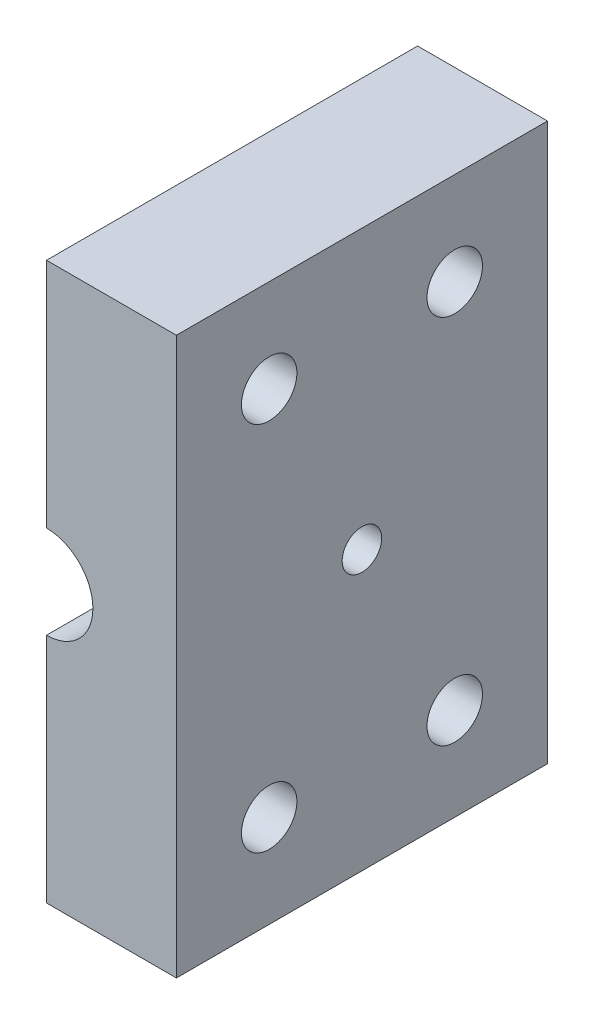
ISO-10303-21;
HEADER;
FILE_DESCRIPTION(('STEP AP214'),'2;1');
FILE_NAME('part.step','',(''),(''),'','','');
FILE_SCHEMA(('AUTOMOTIVE_DESIGN { 1 0 10303 214 1 1 1 1 }'));
ENDSEC;
DATA;
#1=APPLICATION_CONTEXT('core data for automotive mechanical design processes');
#2=APPLICATION_PROTOCOL_DEFINITION('international standard','automotive_design',2000,#1);
#3=PRODUCT_CONTEXT('',#1,'mechanical');
#4=PRODUCT('Part','Part','',(#3));
#5=PRODUCT_RELATED_PRODUCT_CATEGORY('part','',(#4));
#6=PRODUCT_DEFINITION_FORMATION('','',#4);
#7=PRODUCT_DEFINITION_CONTEXT('part definition',#1,'design');
#8=PRODUCT_DEFINITION('design','',#6,#7);
#9=PRODUCT_DEFINITION_SHAPE('','',#8);
#10=(LENGTH_UNIT() NAMED_UNIT(*) SI_UNIT(.MILLI.,.METRE.));
#11=(NAMED_UNIT(*) PLANE_ANGLE_UNIT() SI_UNIT($,.RADIAN.));
#12=(NAMED_UNIT(*) SI_UNIT($,.STERADIAN.) SOLID_ANGLE_UNIT());
#13=UNCERTAINTY_MEASURE_WITH_UNIT(LENGTH_MEASURE(1.E-05),#10,'distance_accuracy_value','');
#14=(GEOMETRIC_REPRESENTATION_CONTEXT(3) GLOBAL_UNCERTAINTY_ASSIGNED_CONTEXT((#13)) GLOBAL_UNIT_ASSIGNED_CONTEXT((#10,
#11,#12)) REPRESENTATION_CONTEXT('',''));
#15=CARTESIAN_POINT('',(0.,0.,0.));
#16=DIRECTION('',(0.,0.,1.));
#17=DIRECTION('',(1.,0.,0.));
#18=AXIS2_PLACEMENT_3D('',#15,#16,#17);
#19=CARTESIAN_POINT('',(4.445,-12.7,12.7));
#20=DIRECTION('',(-1.,0.,0.));
#21=DIRECTION('',(0.,0.,1.));
#22=AXIS2_PLACEMENT_3D('',#19,#20,#21);
#23=PLANE('',#22);
#24=CARTESIAN_POINT('',(4.445,-6.34988648419594,0.));
#25=DIRECTION('',(1.,0.,0.));
#26=DIRECTION('',(0.,0.,-1.));
#27=AXIS2_PLACEMENT_3D('',#24,#25,#26);
#28=CIRCLE('',#27,1.35255);
#29=CARTESIAN_POINT('',(4.445,-6.34988648419594,-1.35255));
#30=VERTEX_POINT('',#29);
#31=EDGE_CURVE('E183',#30,#30,#28,.T.);
#32=ORIENTED_EDGE('',*,*,#31,.F.);
#33=EDGE_LOOP('',(#32));
#34=FACE_BOUND('',#33,.T.);
#35=CARTESIAN_POINT('',(4.445,-19.0498864841959,6.35));
#36=DIRECTION('',(1.,0.,0.));
#37=DIRECTION('',(0.,0.,-1.));
#38=AXIS2_PLACEMENT_3D('',#35,#36,#37);
#39=CIRCLE('',#38,1.89864999999999);
#40=CARTESIAN_POINT('',(4.445,-19.0498864841959,4.45135000000001));
#41=VERTEX_POINT('',#40);
#42=EDGE_CURVE('E179',#41,#41,#39,.T.);
#43=ORIENTED_EDGE('',*,*,#42,.F.);
#44=EDGE_LOOP('',(#43));
#45=FACE_BOUND('',#44,.T.);
#46=CARTESIAN_POINT('',(4.445,6.35,6.35));
#47=DIRECTION('',(1.,0.,0.));
#48=DIRECTION('',(0.,0.,-1.));
#49=AXIS2_PLACEMENT_3D('',#46,#47,#48);
#50=CIRCLE('',#49,1.89864999999999);
#51=CARTESIAN_POINT('',(4.445,6.35,4.45135000000001));
#52=VERTEX_POINT('',#51);
#53=EDGE_CURVE('E138',#52,#52,#50,.T.);
#54=ORIENTED_EDGE('',*,*,#53,.F.);
#55=EDGE_LOOP('',(#54));
#56=FACE_BOUND('',#55,.T.);
#57=CARTESIAN_POINT('',(4.445,6.35,-6.35));
#58=DIRECTION('',(1.,0.,0.));
#59=DIRECTION('',(0.,0.,-1.));
#60=AXIS2_PLACEMENT_3D('',#57,#58,#59);
#61=CIRCLE('',#60,1.89864999999999);
#62=CARTESIAN_POINT('',(4.445,6.35,-8.24864999999999));
#63=VERTEX_POINT('',#62);
#64=EDGE_CURVE('E127',#63,#63,#61,.T.);
#65=ORIENTED_EDGE('',*,*,#64,.F.);
#66=EDGE_LOOP('',(#65));
#67=FACE_BOUND('',#66,.T.);
#68=DIRECTION('',(0.,0.,-1.));
#69=VECTOR('',#68,1.);
#70=CARTESIAN_POINT('',(4.445,12.7,12.7));
#71=LINE('',#70,#69);
#72=CARTESIAN_POINT('',(4.445,12.7,12.7));
#73=VERTEX_POINT('',#72);
#74=CARTESIAN_POINT('',(4.445,12.7,-12.7));
#75=VERTEX_POINT('',#74);
#76=EDGE_CURVE('E53',#73,#75,#71,.T.);
#77=ORIENTED_EDGE('',*,*,#76,.F.);
#78=DIRECTION('',(0.,1.,0.));
#79=VECTOR('',#78,1.);
#80=CARTESIAN_POINT('',(4.445,-12.7,12.7));
#81=LINE('',#80,#79);
#82=CARTESIAN_POINT('',(4.445,-25.3998864841959,12.7));
#83=VERTEX_POINT('',#82);
#84=EDGE_CURVE('E104',#83,#73,#81,.T.);
#85=ORIENTED_EDGE('',*,*,#84,.F.);
#86=DIRECTION('',(0.,0.,-1.));
#87=VECTOR('',#86,1.);
#88=CARTESIAN_POINT('',(4.445,-25.3998864841959,12.7));
#89=LINE('',#88,#87);
#90=CARTESIAN_POINT('',(4.445,-25.3998864841959,-12.7));
#91=VERTEX_POINT('',#90);
#92=EDGE_CURVE('E146',#83,#91,#89,.T.);
#93=ORIENTED_EDGE('',*,*,#92,.T.);
#94=DIRECTION('',(0.,1.,0.));
#95=VECTOR('',#94,1.);
#96=CARTESIAN_POINT('',(4.445,-12.7,-12.7));
#97=LINE('',#96,#95);
#98=EDGE_CURVE('E92',#91,#75,#97,.T.);
#99=ORIENTED_EDGE('',*,*,#98,.T.);
#100=EDGE_LOOP('',(#77,#85,#93,#99));
#101=FACE_BOUND('',#100,.T.);
#102=CARTESIAN_POINT('',(4.445,-19.0498864841959,-6.35));
#103=DIRECTION('',(1.,0.,0.));
#104=DIRECTION('',(0.,0.,-1.));
#105=AXIS2_PLACEMENT_3D('',#102,#103,#104);
#106=CIRCLE('',#105,1.89864999999999);
#107=CARTESIAN_POINT('',(4.445,-19.0498864841959,-8.24864999999999));
#108=VERTEX_POINT('',#107);
#109=EDGE_CURVE('E171',#108,#108,#106,.T.);
#110=ORIENTED_EDGE('',*,*,#109,.F.);
#111=EDGE_LOOP('',(#110));
#112=FACE_BOUND('',#111,.T.);
#113=ADVANCED_FACE('F39',(#34,#45,#56,#67,#101,#112),#23,.F.);
#114=CARTESIAN_POINT('',(-4.445,-12.7,12.7));
#115=DIRECTION('',(1.,0.,0.));
#116=DIRECTION('',(0.,0.,-1.));
#117=AXIS2_PLACEMENT_3D('',#114,#115,#116);
#118=PLANE('',#117);
#119=CARTESIAN_POINT('',(-4.445,6.35,-6.35));
#120=DIRECTION('',(1.,0.,0.));
#121=DIRECTION('',(0.,0.,-1.));
#122=AXIS2_PLACEMENT_3D('',#119,#120,#121);
#123=CIRCLE('',#122,1.89865);
#124=CARTESIAN_POINT('',(-4.445,6.35,-8.24865));
#125=VERTEX_POINT('',#124);
#126=EDGE_CURVE('E122',#125,#125,#123,.T.);
#127=ORIENTED_EDGE('',*,*,#126,.T.);
#128=EDGE_LOOP('',(#127));
#129=FACE_BOUND('',#128,.T.);
#130=CARTESIAN_POINT('',(-4.445,6.35,6.35));
#131=DIRECTION('',(1.,0.,0.));
#132=DIRECTION('',(0.,0.,-1.));
#133=AXIS2_PLACEMENT_3D('',#130,#131,#132);
#134=CIRCLE('',#133,1.89865);
#135=CARTESIAN_POINT('',(-4.445,6.35,4.45135));
#136=VERTEX_POINT('',#135);
#137=EDGE_CURVE('E132',#136,#136,#134,.T.);
#138=ORIENTED_EDGE('',*,*,#137,.T.);
#139=EDGE_LOOP('',(#138));
#140=FACE_BOUND('',#139,.T.);
#141=DIRECTION('',(0.,0.,1.));
#142=VECTOR('',#141,1.);
#143=CARTESIAN_POINT('',(-4.445,-3.17488648419594,-12.7));
#144=LINE('',#143,#142);
#145=CARTESIAN_POINT('',(-4.445,-3.17488648419594,12.7));
#146=VERTEX_POINT('',#145);
#147=CARTESIAN_POINT('',(-4.445,-3.17488648419594,-12.7));
#148=VERTEX_POINT('',#147);
#149=EDGE_CURVE('E60',#146,#148,#144,.F.);
#150=ORIENTED_EDGE('',*,*,#149,.F.);
#151=DIRECTION('',(0.,-1.,0.));
#152=VECTOR('',#151,1.);
#153=CARTESIAN_POINT('',(-4.445,-12.7,12.7));
#154=LINE('',#153,#152);
#155=CARTESIAN_POINT('',(-4.445,12.7,12.7));
#156=VERTEX_POINT('',#155);
#157=EDGE_CURVE('E98',#156,#146,#154,.T.);
#158=ORIENTED_EDGE('',*,*,#157,.F.);
#159=DIRECTION('',(0.,0.,-1.));
#160=VECTOR('',#159,1.);
#161=CARTESIAN_POINT('',(-4.445,12.7,12.7));
#162=LINE('',#161,#160);
#163=CARTESIAN_POINT('',(-4.445,12.7,-12.7));
#164=VERTEX_POINT('',#163);
#165=EDGE_CURVE('E84',#156,#164,#162,.T.);
#166=ORIENTED_EDGE('',*,*,#165,.T.);
#167=DIRECTION('',(0.,-1.,0.));
#168=VECTOR('',#167,1.);
#169=CARTESIAN_POINT('',(-4.445,-12.7,-12.7));
#170=LINE('',#169,#168);
#171=EDGE_CURVE('E97',#164,#148,#170,.T.);
#172=ORIENTED_EDGE('',*,*,#171,.T.);
#173=EDGE_LOOP('',(#150,#158,#166,#172));
#174=FACE_BOUND('',#173,.T.);
#175=ADVANCED_FACE('F96',(#129,#140,#174),#118,.F.);
#176=CARTESIAN_POINT('',(-4.445,-19.0498864841959,6.35));
#177=DIRECTION('',(1.,0.,0.));
#178=DIRECTION('',(0.,0.,-1.));
#179=AXIS2_PLACEMENT_3D('',#176,#177,#178);
#180=CIRCLE('',#179,1.89865);
#181=CARTESIAN_POINT('',(-4.445,-19.0498864841959,4.45135));
#182=VERTEX_POINT('',#181);
#183=EDGE_CURVE('E175',#182,#182,#180,.T.);
#184=ORIENTED_EDGE('',*,*,#183,.T.);
#185=EDGE_LOOP('',(#184));
#186=FACE_BOUND('',#185,.T.);
#187=CARTESIAN_POINT('',(-4.445,-19.0498864841959,-6.35));
#188=DIRECTION('',(1.,0.,0.));
#189=DIRECTION('',(0.,0.,-1.));
#190=AXIS2_PLACEMENT_3D('',#187,#188,#189);
#191=CIRCLE('',#190,1.89865);
#192=CARTESIAN_POINT('',(-4.445,-19.0498864841959,-8.24865));
#193=VERTEX_POINT('',#192);
#194=EDGE_CURVE('E167',#193,#193,#191,.T.);
#195=ORIENTED_EDGE('',*,*,#194,.T.);
#196=EDGE_LOOP('',(#195));
#197=FACE_BOUND('',#196,.T.);
#198=DIRECTION('',(0.,0.,1.));
#199=VECTOR('',#198,1.);
#200=CARTESIAN_POINT('',(-4.445,-9.52488648419594,-12.7));
#201=LINE('',#200,#199);
#202=CARTESIAN_POINT('',(-4.445,-9.52488648419594,-12.7));
#203=VERTEX_POINT('',#202);
#204=CARTESIAN_POINT('',(-4.445,-9.52488648419594,12.7));
#205=VERTEX_POINT('',#204);
#206=EDGE_CURVE('E159',#203,#205,#201,.T.);
#207=ORIENTED_EDGE('',*,*,#206,.F.);
#208=CARTESIAN_POINT('',(-4.445,-25.3998864841959,-12.7));
#209=VERTEX_POINT('',#208);
#210=EDGE_CURVE('E91',#203,#209,#170,.T.);
#211=ORIENTED_EDGE('',*,*,#210,.T.);
#212=DIRECTION('',(0.,0.,-1.));
#213=VECTOR('',#212,1.);
#214=CARTESIAN_POINT('',(-4.445,-25.3998864841959,12.7));
#215=LINE('',#214,#213);
#216=CARTESIAN_POINT('',(-4.445,-25.3998864841959,12.7));
#217=VERTEX_POINT('',#216);
#218=EDGE_CURVE('E142',#217,#209,#215,.T.);
#219=ORIENTED_EDGE('',*,*,#218,.F.);
#220=EDGE_CURVE('E115',#205,#217,#154,.T.);
#221=ORIENTED_EDGE('',*,*,#220,.F.);
#222=EDGE_LOOP('',(#207,#211,#219,#221));
#223=FACE_BOUND('',#222,.T.);
#224=ADVANCED_FACE('F214',(#186,#197,#223),#118,.F.);
#225=CARTESIAN_POINT('',(-4.445,12.7,12.7));
#226=DIRECTION('',(0.,-1.,0.));
#227=DIRECTION('',(0.,0.,-1.));
#228=AXIS2_PLACEMENT_3D('',#225,#226,#227);
#229=PLANE('',#228);
#230=DIRECTION('',(-1.,0.,0.));
#231=VECTOR('',#230,1.);
#232=CARTESIAN_POINT('',(-4.445,12.7,-12.7));
#233=LINE('',#232,#231);
#234=EDGE_CURVE('E81',#75,#164,#233,.T.);
#235=ORIENTED_EDGE('',*,*,#234,.T.);
#236=ORIENTED_EDGE('',*,*,#165,.F.);
#237=DIRECTION('',(-1.,0.,0.));
#238=VECTOR('',#237,1.);
#239=CARTESIAN_POINT('',(-4.445,12.7,12.7));
#240=LINE('',#239,#238);
#241=EDGE_CURVE('E68',#73,#156,#240,.T.);
#242=ORIENTED_EDGE('',*,*,#241,.F.);
#243=ORIENTED_EDGE('',*,*,#76,.T.);
#244=EDGE_LOOP('',(#235,#236,#242,#243));
#245=FACE_BOUND('',#244,.T.);
#246=ADVANCED_FACE('F83',(#245),#229,.F.);
#247=CARTESIAN_POINT('',(0.,0.,12.7));
#248=DIRECTION('',(0.,0.,-1.));
#249=DIRECTION('',(-1.,0.,0.));
#250=AXIS2_PLACEMENT_3D('',#247,#248,#249);
#251=PLANE('',#250);
#252=CARTESIAN_POINT('',(-4.445,-6.34988648419594,12.7));
#253=DIRECTION('',(0.,0.,-1.));
#254=DIRECTION('',(1.,0.,0.));
#255=AXIS2_PLACEMENT_3D('',#252,#253,#254);
#256=CIRCLE('',#255,3.175);
#257=EDGE_CURVE('E163',#146,#205,#256,.T.);
#258=ORIENTED_EDGE('',*,*,#257,.T.);
#259=ORIENTED_EDGE('',*,*,#220,.T.);
#260=DIRECTION('',(-1.,0.,0.));
#261=VECTOR('',#260,1.);
#262=CARTESIAN_POINT('',(-4.445,-25.3998864841959,12.7));
#263=LINE('',#262,#261);
#264=EDGE_CURVE('E149',#83,#217,#263,.T.);
#265=ORIENTED_EDGE('',*,*,#264,.F.);
#266=ORIENTED_EDGE('',*,*,#84,.T.);
#267=ORIENTED_EDGE('',*,*,#241,.T.);
#268=ORIENTED_EDGE('',*,*,#157,.T.);
#269=EDGE_LOOP('',(#258,#259,#265,#266,#267,#268));
#270=FACE_BOUND('',#269,.T.);
#271=ADVANCED_FACE('F232',(#270),#251,.F.);
#272=CARTESIAN_POINT('',(0.,0.,-12.7));
#273=DIRECTION('',(0.,0.,-1.));
#274=DIRECTION('',(-1.,0.,0.));
#275=AXIS2_PLACEMENT_3D('',#272,#273,#274);
#276=PLANE('',#275);
#277=ORIENTED_EDGE('',*,*,#210,.F.);
#278=CARTESIAN_POINT('',(-4.445,-6.34988648419594,-12.7));
#279=DIRECTION('',(0.,0.,-1.));
#280=DIRECTION('',(-1.,0.,0.));
#281=AXIS2_PLACEMENT_3D('',#278,#279,#280);
#282=CIRCLE('',#281,3.175);
#283=EDGE_CURVE('E11',#203,#148,#282,.F.);
#284=ORIENTED_EDGE('',*,*,#283,.T.);
#285=ORIENTED_EDGE('',*,*,#171,.F.);
#286=ORIENTED_EDGE('',*,*,#234,.F.);
#287=ORIENTED_EDGE('',*,*,#98,.F.);
#288=DIRECTION('',(-1.,0.,0.));
#289=VECTOR('',#288,1.);
#290=CARTESIAN_POINT('',(-4.445,-25.3998864841959,-12.7));
#291=LINE('',#290,#289);
#292=EDGE_CURVE('E150',#91,#209,#291,.T.);
#293=ORIENTED_EDGE('',*,*,#292,.T.);
#294=EDGE_LOOP('',(#277,#284,#285,#286,#287,#293));
#295=FACE_BOUND('',#294,.T.);
#296=ADVANCED_FACE('F102',(#295),#276,.T.);
#297=CARTESIAN_POINT('',(4.445,6.35,-6.35));
#298=DIRECTION('',(1.,0.,0.));
#299=DIRECTION('',(0.,0.,-1.));
#300=AXIS2_PLACEMENT_3D('',#297,#298,#299);
#301=CYLINDRICAL_SURFACE('',#300,1.89864999999999);
#302=ORIENTED_EDGE('',*,*,#126,.F.);
#303=EDGE_LOOP('',(#302));
#304=FACE_BOUND('',#303,.T.);
#305=ORIENTED_EDGE('',*,*,#64,.T.);
#306=EDGE_LOOP('',(#305));
#307=FACE_BOUND('',#306,.T.);
#308=ADVANCED_FACE('F255',(#304,#307),#301,.F.);
#309=CARTESIAN_POINT('',(4.445,6.35,6.35));
#310=DIRECTION('',(1.,0.,0.));
#311=DIRECTION('',(0.,0.,-1.));
#312=AXIS2_PLACEMENT_3D('',#309,#310,#311);
#313=CYLINDRICAL_SURFACE('',#312,1.89864999999999);
#314=ORIENTED_EDGE('',*,*,#137,.F.);
#315=EDGE_LOOP('',(#314));
#316=FACE_BOUND('',#315,.T.);
#317=ORIENTED_EDGE('',*,*,#53,.T.);
#318=EDGE_LOOP('',(#317));
#319=FACE_BOUND('',#318,.T.);
#320=ADVANCED_FACE('F205',(#316,#319),#313,.F.);
#321=CARTESIAN_POINT('',(-4.445,-25.3998864841959,12.7));
#322=DIRECTION('',(0.,-1.,0.));
#323=DIRECTION('',(0.,0.,-1.));
#324=AXIS2_PLACEMENT_3D('',#321,#322,#323);
#325=PLANE('',#324);
#326=ORIENTED_EDGE('',*,*,#292,.F.);
#327=ORIENTED_EDGE('',*,*,#92,.F.);
#328=ORIENTED_EDGE('',*,*,#264,.T.);
#329=ORIENTED_EDGE('',*,*,#218,.T.);
#330=EDGE_LOOP('',(#326,#327,#328,#329));
#331=FACE_BOUND('',#330,.T.);
#332=ADVANCED_FACE('F197',(#331),#325,.T.);
#333=CARTESIAN_POINT('',(-4.445,-6.34988648419594,-12.7));
#334=DIRECTION('',(0.,0.,1.));
#335=DIRECTION('',(1.,0.,0.));
#336=AXIS2_PLACEMENT_3D('',#333,#334,#335);
#337=CYLINDRICAL_SURFACE('',#336,3.175);
#338=CARTESIAN_POINT('',(-1.27,-6.34988648419594,-1.35255));
#339=CARTESIAN_POINT('',(-1.27000623572589,-6.42219846451424,-1.35254177520316));
#340=CARTESIAN_POINT('',(-1.27249877734005,-6.49461684016538,-1.34671677085276));
#341=CARTESIAN_POINT('',(-1.28222933200378,-6.63739473726526,-1.32362700946327));
#342=CARTESIAN_POINT('',(-1.28947941494836,-6.7077485453532,-1.30633315473188));
#343=CARTESIAN_POINT('',(-1.30794757605062,-6.84409542411831,-1.26106652134826));
#344=CARTESIAN_POINT('',(-1.31915195717244,-6.91010262588238,-1.23313057893921));
#345=CARTESIAN_POINT('',(-1.3444448189785,-7.03642729183296,-1.16752831329107));
#346=CARTESIAN_POINT('',(-1.3585324980903,-7.09674633056627,-1.12986469363826));
#347=CARTESIAN_POINT('',(-1.38900915331412,-7.21321710574948,-1.0438105223501));
#348=CARTESIAN_POINT('',(-1.40547568228455,-7.26903452718969,-0.994995222634553));
#349=CARTESIAN_POINT('',(-1.43852728544038,-7.37198028393577,-0.888922536238248));
#350=CARTESIAN_POINT('',(-1.45511241953689,-7.41910385014982,-0.831660546858984));
#351=CARTESIAN_POINT('',(-1.48749082528527,-7.50574837069998,-0.706716145718509));
#352=CARTESIAN_POINT('',(-1.50319814752368,-7.54474693296262,-0.638646839132888));
#353=CARTESIAN_POINT('',(-1.53080506901161,-7.6105914820798,-0.49615021576441));
#354=CARTESIAN_POINT('',(-1.54270671610151,-7.63744400797353,-0.421726345794151));
#355=CARTESIAN_POINT('',(-1.56051145918116,-7.6768378559283,-0.272481782098255));
#356=CARTESIAN_POINT('',(-1.56668329881164,-7.69002415000419,-0.197864666492723));
#357=CARTESIAN_POINT('',(-1.57309836071018,-7.70372154087681,-0.0472414110769816));
#358=CARTESIAN_POINT('',(-1.57334506936866,-7.70424009146956,0.0287638855657466));
#359=CARTESIAN_POINT('',(-1.568108377168,-7.69307144302101,0.173443537838061));
#360=CARTESIAN_POINT('',(-1.56308648663574,-7.68236735611834,0.242213910729962));
#361=CARTESIAN_POINT('',(-1.54866138788291,-7.65071197240058,0.376868979127113));
#362=CARTESIAN_POINT('',(-1.53925729498791,-7.62975860642926,0.442753089017099));
#363=CARTESIAN_POINT('',(-1.51691251050134,-7.57778735787967,0.571467277566886));
#364=CARTESIAN_POINT('',(-1.50389945655985,-7.5465608060842,0.634199971759613));
#365=CARTESIAN_POINT('',(-1.47581800626709,-7.47507786228482,0.753786225805841));
#366=CARTESIAN_POINT('',(-1.46074878044514,-7.43481782187801,0.810637396664927));
#367=CARTESIAN_POINT('',(-1.42862746406358,-7.34222043412414,0.922155886563748));
#368=CARTESIAN_POINT('',(-1.41151806794821,-7.28912847923528,0.976181952101856));
#369=CARTESIAN_POINT('',(-1.37836740362582,-7.17447632336111,1.07478447159879));
#370=CARTESIAN_POINT('',(-1.36232640930725,-7.11291396326408,1.11935850884433));
#371=CARTESIAN_POINT('',(-1.33261513120812,-6.98104448280009,1.19879081738166));
#372=CARTESIAN_POINT('',(-1.31901451729778,-6.9105565487564,1.23337691862214));
#373=CARTESIAN_POINT('',(-1.29625611843984,-6.76403508112224,1.28997295749315));
#374=CARTESIAN_POINT('',(-1.28709576441307,-6.68800478364138,1.31199016864093));
#375=CARTESIAN_POINT('',(-1.27473667441957,-6.53790593653124,1.34145508065906));
#376=CARTESIAN_POINT('',(-1.27118674037708,-6.46403510206559,1.3497626553015));
#377=CARTESIAN_POINT('',(-1.26931894633364,-6.31587505598112,1.35415007319995));
#378=CARTESIAN_POINT('',(-1.27099949649573,-6.24158597834166,1.35023363201766));
#379=CARTESIAN_POINT('',(-1.27917756400135,-6.09880011825048,1.33088956002413));
#380=CARTESIAN_POINT('',(-1.28541814242532,-6.03020376577893,1.31607566728751));
#381=CARTESIAN_POINT('',(-1.30180917961208,-5.89655136894943,1.27622243273565));
#382=CARTESIAN_POINT('',(-1.31196012658546,-5.83149576781319,1.25118181408736));
#383=CARTESIAN_POINT('',(-1.33559882938075,-5.70447569207693,1.19077167332886));
#384=CARTESIAN_POINT('',(-1.3491808260904,-5.64267102482548,1.15510422025462));
#385=CARTESIAN_POINT('',(-1.37824560386068,-5.52570160440114,1.07477896391606));
#386=CARTESIAN_POINT('',(-1.39372919175528,-5.4705396895055,1.03011733930006));
#387=CARTESIAN_POINT('',(-1.42636323436333,-5.36409570547136,0.929182397251462));
#388=CARTESIAN_POINT('',(-1.44355191136597,-5.31340925341944,0.872291725552819));
#389=CARTESIAN_POINT('',(-1.47664307461845,-5.22212525734779,0.750556976311339));
#390=CARTESIAN_POINT('',(-1.49254521721794,-5.18153040296456,0.685710785307665));
#391=CARTESIAN_POINT('',(-1.52141696954082,-5.11102835560137,0.548342425907144));
#392=CARTESIAN_POINT('',(-1.53433173374422,-5.0813159630934,0.475707882643422));
#393=CARTESIAN_POINT('',(-1.55504298242463,-5.03480720416642,0.325740640673739));
#394=CARTESIAN_POINT('',(-1.56284394545572,-5.01799953386144,0.248412117884265));
#395=CARTESIAN_POINT('',(-1.57173933574315,-4.99892432330592,0.0978910164841012));
#396=CARTESIAN_POINT('',(-1.57331866815372,-4.99560481430568,0.0248599209182086));
#397=CARTESIAN_POINT('',(-1.57089019483181,-5.00076581451601,-0.120681637221436));
#398=CARTESIAN_POINT('',(-1.56688334515951,-5.00924430453002,-0.193192186750541));
#399=CARTESIAN_POINT('',(-1.55418564427915,-5.03686393195468,-0.331824440239766));
#400=CARTESIAN_POINT('',(-1.54574332748994,-5.05544096806303,-0.398083526320236));
#401=CARTESIAN_POINT('',(-1.52533189330868,-5.10216473337459,-0.526552401255484));
#402=CARTESIAN_POINT('',(-1.51336177586075,-5.1303141764986,-0.588761035780507));
#403=CARTESIAN_POINT('',(-1.48633025829184,-5.19737611748046,-0.711549455942926));
#404=CARTESIAN_POINT('',(-1.47112387846321,-5.23684470559234,-0.77179297640017));
#405=CARTESIAN_POINT('',(-1.43971820410057,-5.32466480920209,-0.885130502729461));
#406=CARTESIAN_POINT('',(-1.4235185422797,-5.37301962392983,-0.938221840448122));
#407=CARTESIAN_POINT('',(-1.39044277788364,-5.48168662414724,-1.03999082551859));
#408=CARTESIAN_POINT('',(-1.37361167934036,-5.5426353880506,-1.08800664347723));
#409=CARTESIAN_POINT('',(-1.34242083517483,-5.67233945124827,-1.17317457940271));
#410=CARTESIAN_POINT('',(-1.32806221166188,-5.74109827169172,-1.21032177006529));
#411=CARTESIAN_POINT('',(-1.30361687982752,-5.88353723947577,-1.27194468564941));
#412=CARTESIAN_POINT('',(-1.29346920592053,-5.9571278823606,-1.29660247811649));
#413=CARTESIAN_POINT('',(-1.27834415730268,-6.1078082003418,-1.33295039769719));
#414=CARTESIAN_POINT('',(-1.27335073019146,-6.18488622671191,-1.34468079369904));
#415=CARTESIAN_POINT('',(-1.27040063678853,-6.29148515631913,-1.35160755828298));
#416=CARTESIAN_POINT('',(-1.2699974811717,-6.3206771403385,-1.35255332228377));
#417=CARTESIAN_POINT('',(-1.27,-6.34988648419594,-1.35255));
#418=B_SPLINE_CURVE_WITH_KNOTS('',3,(#338,#339,#340,#341,#342,#343,#344,#345,#346,#347,#348,
#349,#350,#351,#352,#353,#354,#355,#356,#357,#358,#359,#360,#361,#362,#363,#364,#365,#366,#367,
#368,#369,#370,#371,#372,#373,#374,#375,#376,#377,#378,#379,#380,#381,#382,#383,#384,#385,#386,
#387,#388,#389,#390,#391,#392,#393,#394,#395,#396,#397,#398,#399,#400,#401,#402,#403,#404,#405,
#406,#407,#408,#409,#410,#411,#412,#413,#414,#415,#416,#417),.UNSPECIFIED.,.T.,.F.,(4,2,2,2,2,2,
2,2,2,2,2,2,2,2,2,2,2,2,2,2,2,2,2,2,2,2,2,2,2,2,2,2,2,2,2,2,2,2,2,4),(0.,0.216850050638944,
0.434252388523417,0.65090895436824,0.867505370130752,1.09439609589244,1.32141091689532,
1.56022386511507,1.79890809057365,2.02572902648839,2.25241649603317,2.46078251280768,
2.66919061253204,2.88212426261053,3.0951440666222,3.32706321416167,3.55904158793932,
3.79684693152949,4.03451451918156,4.25661426582137,4.47864651050859,4.68904802527597,
4.89947581724865,5.11647002970509,5.33355663169255,5.56682347195774,5.80015241655904,
6.03747459229678,6.27458864785546,6.49280702774581,6.71098806472672,6.91807492424948,
7.12522054501713,7.34512352029504,7.56510830550803,7.80215736760165,8.03931373022261,
8.27290548905712,8.50576753373726,8.59336087119996),.UNSPECIFIED.);
#419=CARTESIAN_POINT('',(-1.27,-6.34988648419594,-1.35255));
#420=VERTEX_POINT('',#419);
#421=EDGE_CURVE('E42',#420,#420,#418,.T.);
#422=ORIENTED_EDGE('',*,*,#421,.F.);
#423=EDGE_LOOP('',(#422));
#424=FACE_BOUND('',#423,.T.);
#425=ORIENTED_EDGE('',*,*,#149,.T.);
#426=ORIENTED_EDGE('',*,*,#283,.F.);
#427=ORIENTED_EDGE('',*,*,#206,.T.);
#428=ORIENTED_EDGE('',*,*,#257,.F.);
#429=EDGE_LOOP('',(#425,#426,#427,#428));
#430=FACE_BOUND('',#429,.T.);
#431=ADVANCED_FACE('F194',(#424,#430),#337,.F.);
#432=CARTESIAN_POINT('',(4.445,-19.0498864841959,-6.35));
#433=DIRECTION('',(1.,0.,0.));
#434=DIRECTION('',(0.,0.,-1.));
#435=AXIS2_PLACEMENT_3D('',#432,#433,#434);
#436=CYLINDRICAL_SURFACE('',#435,1.89864999999999);
#437=ORIENTED_EDGE('',*,*,#194,.F.);
#438=EDGE_LOOP('',(#437));
#439=FACE_BOUND('',#438,.T.);
#440=ORIENTED_EDGE('',*,*,#109,.T.);
#441=EDGE_LOOP('',(#440));
#442=FACE_BOUND('',#441,.T.);
#443=ADVANCED_FACE('F196',(#439,#442),#436,.F.);
#444=CARTESIAN_POINT('',(4.445,-19.0498864841959,6.35));
#445=DIRECTION('',(1.,0.,0.));
#446=DIRECTION('',(0.,0.,-1.));
#447=AXIS2_PLACEMENT_3D('',#444,#445,#446);
#448=CYLINDRICAL_SURFACE('',#447,1.89864999999999);
#449=ORIENTED_EDGE('',*,*,#183,.F.);
#450=EDGE_LOOP('',(#449));
#451=FACE_BOUND('',#450,.T.);
#452=ORIENTED_EDGE('',*,*,#42,.T.);
#453=EDGE_LOOP('',(#452));
#454=FACE_BOUND('',#453,.T.);
#455=ADVANCED_FACE('F202',(#451,#454),#448,.F.);
#456=CARTESIAN_POINT('',(4.445,-6.34988648419594,0.));
#457=DIRECTION('',(1.,0.,0.));
#458=DIRECTION('',(0.,0.,-1.));
#459=AXIS2_PLACEMENT_3D('',#456,#457,#458);
#460=CYLINDRICAL_SURFACE('',#459,1.35255);
#461=ORIENTED_EDGE('',*,*,#421,.T.);
#462=EDGE_LOOP('',(#461));
#463=FACE_BOUND('',#462,.T.);
#464=ORIENTED_EDGE('',*,*,#31,.T.);
#465=EDGE_LOOP('',(#464));
#466=FACE_BOUND('',#465,.T.);
#467=ADVANCED_FACE('F192',(#463,#466),#460,.F.);
#468=CLOSED_SHELL('',(#113,#175,#224,#246,#271,#296,#308,#320,#332,#431,#443,#455,#467));
#469=MANIFOLD_SOLID_BREP('B2',#468);
#470=ADVANCED_BREP_SHAPE_REPRESENTATION('',(#18,#469),#14);
#471=SHAPE_DEFINITION_REPRESENTATION(#9,#470);
ENDSEC;
END-ISO-10303-21;
